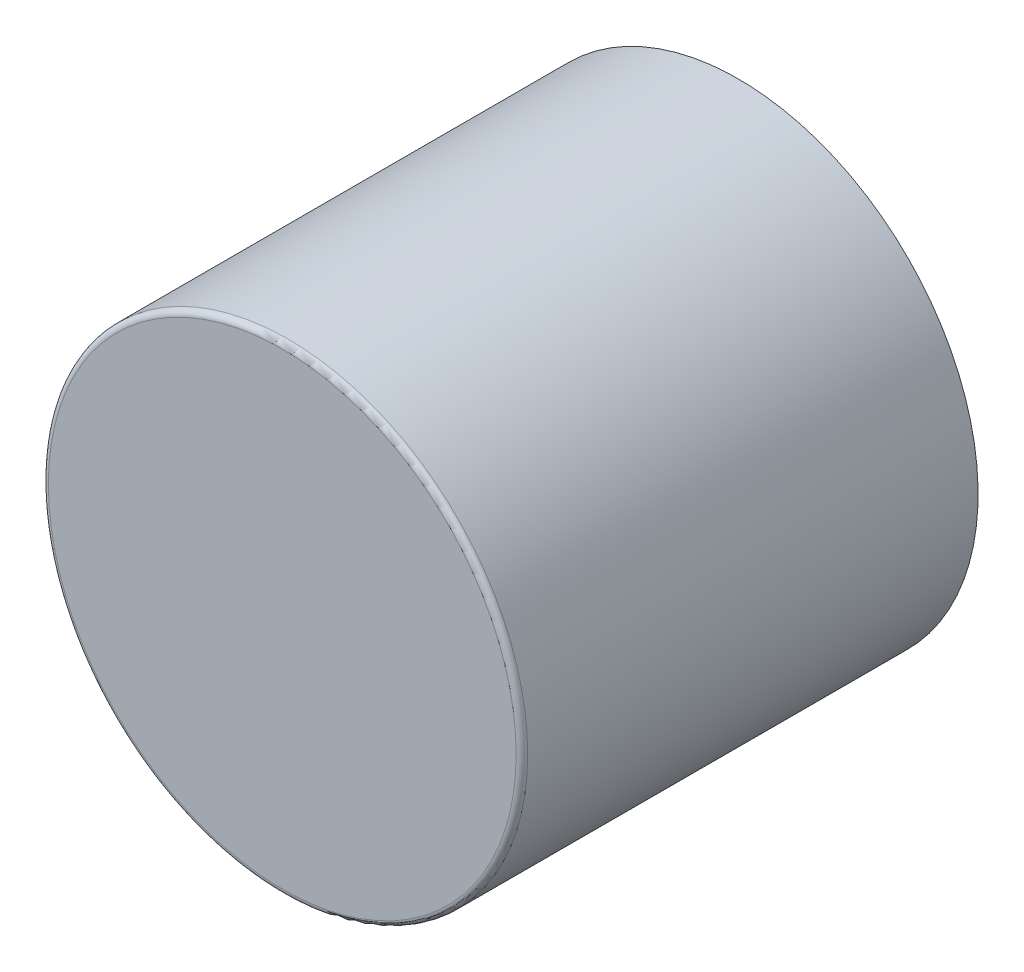
ISO-10303-21;
HEADER;
FILE_DESCRIPTION(('STEP AP214'),'2;1');
FILE_NAME('part.step','',(''),(''),'','','');
FILE_SCHEMA(('AUTOMOTIVE_DESIGN { 1 0 10303 214 1 1 1 1 }'));
ENDSEC;
DATA;
#1=APPLICATION_CONTEXT('core data for automotive mechanical design processes');
#2=APPLICATION_PROTOCOL_DEFINITION('international standard','automotive_design',2000,#1);
#3=PRODUCT_CONTEXT('',#1,'mechanical');
#4=PRODUCT('Part','Part','',(#3));
#5=PRODUCT_RELATED_PRODUCT_CATEGORY('part','',(#4));
#6=PRODUCT_DEFINITION_FORMATION('','',#4);
#7=PRODUCT_DEFINITION_CONTEXT('part definition',#1,'design');
#8=PRODUCT_DEFINITION('design','',#6,#7);
#9=PRODUCT_DEFINITION_SHAPE('','',#8);
#10=(LENGTH_UNIT() NAMED_UNIT(*) SI_UNIT(.MILLI.,.METRE.));
#11=(NAMED_UNIT(*) PLANE_ANGLE_UNIT() SI_UNIT($,.RADIAN.));
#12=(NAMED_UNIT(*) SI_UNIT($,.STERADIAN.) SOLID_ANGLE_UNIT());
#13=UNCERTAINTY_MEASURE_WITH_UNIT(LENGTH_MEASURE(1.E-05),#10,'distance_accuracy_value','');
#14=(GEOMETRIC_REPRESENTATION_CONTEXT(3) GLOBAL_UNCERTAINTY_ASSIGNED_CONTEXT((#13)) GLOBAL_UNIT_ASSIGNED_CONTEXT((#10,
#11,#12)) REPRESENTATION_CONTEXT('',''));
#15=CARTESIAN_POINT('',(0.,0.,0.));
#16=DIRECTION('',(0.,0.,1.));
#17=DIRECTION('',(1.,0.,0.));
#18=AXIS2_PLACEMENT_3D('',#15,#16,#17);
#19=CARTESIAN_POINT('',(0.,0.,-74.5));
#20=DIRECTION('',(0.,0.,-1.));
#21=DIRECTION('',(-1.,0.,0.));
#22=AXIS2_PLACEMENT_3D('',#19,#20,#21);
#23=PLANE('',#22);
#24=DIRECTION('',(0.,1.,0.));
#25=VECTOR('',#24,1.);
#26=CARTESIAN_POINT('',(2.59701534781144,1.0458509339609,-74.5));
#27=LINE('',#26,#25);
#28=CARTESIAN_POINT('',(2.59701534781145,-0.487898426832757,-74.5));
#29=VERTEX_POINT('',#28);
#30=CARTESIAN_POINT('',(2.59701534781144,1.0458509339609,-74.5));
#31=VERTEX_POINT('',#30);
#32=EDGE_CURVE('E149',#29,#31,#27,.T.);
#33=ORIENTED_EDGE('',*,*,#32,.F.);
#34=CARTESIAN_POINT('',(11.0970153478114,40.132293596347,-74.5));
#35=DIRECTION('',(0.,0.,-1.));
#36=DIRECTION('',(-1.,0.,0.));
#37=AXIS2_PLACEMENT_3D('',#34,#35,#36);
#38=CIRCLE('',#37,41.5);
#39=CARTESIAN_POINT('',(1.09694998908181,-0.144854922647389,-74.5));
#40=VERTEX_POINT('',#39);
#41=EDGE_CURVE('E174',#29,#40,#38,.T.);
#42=ORIENTED_EDGE('',*,*,#41,.T.);
#43=DIRECTION('',(0.,-1.,0.));
#44=VECTOR('',#43,1.);
#45=CARTESIAN_POINT('',(1.09694998908181,0.,-74.5));
#46=LINE('',#45,#44);
#47=CARTESIAN_POINT('',(1.09694998908181,1.40247700988313,-74.5));
#48=VERTEX_POINT('',#47);
#49=EDGE_CURVE('E81',#48,#40,#46,.T.);
#50=ORIENTED_EDGE('',*,*,#49,.F.);
#51=CARTESIAN_POINT('',(11.0970153478114,40.132293596347,-74.5));
#52=DIRECTION('',(0.,0.,-1.));
#53=DIRECTION('',(-1.,0.,0.));
#54=AXIS2_PLACEMENT_3D('',#51,#52,#53);
#55=CIRCLE('',#54,40.);
#56=EDGE_CURVE('E167',#48,#31,#55,.F.);
#57=ORIENTED_EDGE('',*,*,#56,.T.);
#58=EDGE_LOOP('',(#33,#42,#50,#57));
#59=FACE_BOUND('',#58,.T.);
#60=ADVANCED_FACE('F51',(#59),#23,.T.);
#61=CARTESIAN_POINT('',(11.0970153478114,40.132293596347,1.5));
#62=DIRECTION('',(0.,0.,-1.));
#63=DIRECTION('',(-1.,0.,0.));
#64=AXIS2_PLACEMENT_3D('',#61,#62,#63);
#65=CYLINDRICAL_SURFACE('',#64,41.5000000000001);
#66=CARTESIAN_POINT('',(11.0970153478114,40.132293596347,0.5));
#67=DIRECTION('',(0.,0.,1.));
#68=DIRECTION('',(1.,0.,0.));
#69=AXIS2_PLACEMENT_3D('',#66,#67,#68);
#70=CIRCLE('',#69,41.5000000000001);
#71=CARTESIAN_POINT('',(52.5970153478115,40.132293596347,0.5));
#72=VERTEX_POINT('',#71);
#73=EDGE_CURVE('E213',#72,#72,#70,.F.);
#74=ORIENTED_EDGE('',*,*,#73,.T.);
#75=EDGE_LOOP('',(#74));
#76=FACE_BOUND('',#75,.T.);
#77=ORIENTED_EDGE('',*,*,#41,.F.);
#78=DIRECTION('',(0.,0.,-1.));
#79=VECTOR('',#78,1.);
#80=CARTESIAN_POINT('',(2.59701534781145,-0.487898426832757,-59.5));
#81=LINE('',#80,#79);
#82=CARTESIAN_POINT('',(2.59701534781145,-0.487898426832757,-59.5));
#83=VERTEX_POINT('',#82);
#84=EDGE_CURVE('E159',#83,#29,#81,.T.);
#85=ORIENTED_EDGE('',*,*,#84,.F.);
#86=CARTESIAN_POINT('',(11.0970153478114,40.132293596347,-59.5));
#87=DIRECTION('',(0.,0.,-1.));
#88=DIRECTION('',(-1.,0.,0.));
#89=AXIS2_PLACEMENT_3D('',#86,#87,#88);
#90=CIRCLE('',#89,41.5);
#91=CARTESIAN_POINT('',(19.5970153478114,-0.487898426832756,-59.5));
#92=VERTEX_POINT('',#91);
#93=EDGE_CURVE('E138',#92,#83,#90,.T.);
#94=ORIENTED_EDGE('',*,*,#93,.F.);
#95=DIRECTION('',(0.,0.,-1.));
#96=VECTOR('',#95,1.);
#97=CARTESIAN_POINT('',(19.5970153478114,-0.487898426832756,-59.5));
#98=LINE('',#97,#96);
#99=CARTESIAN_POINT('',(19.5970153478114,-0.487898426832756,-74.5));
#100=VERTEX_POINT('',#99);
#101=EDGE_CURVE('E134',#92,#100,#98,.T.);
#102=ORIENTED_EDGE('',*,*,#101,.T.);
#103=CARTESIAN_POINT('',(21.0969499890533,-0.14488737713831,-74.5));
#104=VERTEX_POINT('',#103);
#105=EDGE_CURVE('E175',#104,#100,#38,.T.);
#106=ORIENTED_EDGE('',*,*,#105,.F.);
#107=DIRECTION('',(0.,0.,-1.));
#108=VECTOR('',#107,1.);
#109=CARTESIAN_POINT('',(21.0969499890533,-0.14488737713831,-74.5));
#110=LINE('',#109,#108);
#111=CARTESIAN_POINT('',(21.0969499890533,-0.14488737713831,-77.5));
#112=VERTEX_POINT('',#111);
#113=EDGE_CURVE('E192',#104,#112,#110,.T.);
#114=ORIENTED_EDGE('',*,*,#113,.T.);
#115=CARTESIAN_POINT('',(11.0970153478114,40.132293596347,-77.5));
#116=DIRECTION('',(0.,0.,-1.));
#117=DIRECTION('',(-1.,0.,0.));
#118=AXIS2_PLACEMENT_3D('',#115,#116,#117);
#119=CIRCLE('',#118,41.5);
#120=CARTESIAN_POINT('',(1.09694998908181,-0.144854922647389,-77.5));
#121=VERTEX_POINT('',#120);
#122=EDGE_CURVE('E205',#121,#112,#119,.T.);
#123=ORIENTED_EDGE('',*,*,#122,.F.);
#124=DIRECTION('',(0.,0.,-1.));
#125=VECTOR('',#124,1.);
#126=CARTESIAN_POINT('',(1.09694998908181,-0.144854922647389,-74.5));
#127=LINE('',#126,#125);
#128=EDGE_CURVE('E188',#40,#121,#127,.T.);
#129=ORIENTED_EDGE('',*,*,#128,.F.);
#130=EDGE_LOOP('',(#77,#85,#94,#102,#106,#114,#123,#129));
#131=FACE_BOUND('',#130,.T.);
#132=ADVANCED_FACE('F232',(#76,#131),#65,.T.);
#133=CARTESIAN_POINT('',(11.0970153478114,40.132293596347,-77.5));
#134=DIRECTION('',(0.,0.,-1.));
#135=DIRECTION('',(-1.,0.,0.));
#136=AXIS2_PLACEMENT_3D('',#133,#134,#135);
#137=PLANE('',#136);
#138=CARTESIAN_POINT('',(11.0970153478114,40.132293596347,-77.5));
#139=DIRECTION('',(0.,0.,-1.));
#140=DIRECTION('',(-1.,0.,0.));
#141=AXIS2_PLACEMENT_3D('',#138,#139,#140);
#142=CIRCLE('',#141,40.);
#143=CARTESIAN_POINT('',(1.09694998908181,1.40247700988313,-77.5));
#144=VERTEX_POINT('',#143);
#145=CARTESIAN_POINT('',(21.0969499890533,1.40244325877292,-77.5));
#146=VERTEX_POINT('',#145);
#147=EDGE_CURVE('E191',#144,#146,#142,.T.);
#148=ORIENTED_EDGE('',*,*,#147,.F.);
#149=DIRECTION('',(0.,-1.,0.));
#150=VECTOR('',#149,1.);
#151=CARTESIAN_POINT('',(1.09694998908181,0.,-77.5));
#152=LINE('',#151,#150);
#153=EDGE_CURVE('E180',#144,#121,#152,.T.);
#154=ORIENTED_EDGE('',*,*,#153,.T.);
#155=ORIENTED_EDGE('',*,*,#122,.T.);
#156=DIRECTION('',(0.,1.,0.));
#157=VECTOR('',#156,1.);
#158=CARTESIAN_POINT('',(21.0969499890533,0.,-77.5));
#159=LINE('',#158,#157);
#160=EDGE_CURVE('E166',#112,#146,#159,.T.);
#161=ORIENTED_EDGE('',*,*,#160,.T.);
#162=EDGE_LOOP('',(#148,#154,#155,#161));
#163=FACE_BOUND('',#162,.T.);
#164=ADVANCED_FACE('F240',(#163),#137,.T.);
#165=CARTESIAN_POINT('',(11.0970153478114,40.132293596347,-77.5));
#166=DIRECTION('',(0.,0.,1.));
#167=DIRECTION('',(1.,0.,0.));
#168=AXIS2_PLACEMENT_3D('',#165,#166,#167);
#169=CYLINDRICAL_SURFACE('',#168,40.);
#170=CARTESIAN_POINT('',(11.0970153478114,40.132293596347,-1.));
#171=DIRECTION('',(0.,0.,1.));
#172=DIRECTION('',(1.,0.,0.));
#173=AXIS2_PLACEMENT_3D('',#170,#171,#172);
#174=CIRCLE('',#173,40.);
#175=CARTESIAN_POINT('',(51.0970153478114,40.132293596347,-1.));
#176=VERTEX_POINT('',#175);
#177=EDGE_CURVE('E11',#176,#176,#174,.T.);
#178=ORIENTED_EDGE('',*,*,#177,.T.);
#179=EDGE_LOOP('',(#178));
#180=FACE_BOUND('',#179,.T.);
#181=DIRECTION('',(0.,0.,-1.));
#182=VECTOR('',#181,1.);
#183=CARTESIAN_POINT('',(2.59701534781144,1.0458509339609,-59.5));
#184=LINE('',#183,#182);
#185=CARTESIAN_POINT('',(2.59701534781144,1.0458509339609,-59.5));
#186=VERTEX_POINT('',#185);
#187=EDGE_CURVE('E184',#186,#31,#184,.T.);
#188=ORIENTED_EDGE('',*,*,#187,.T.);
#189=ORIENTED_EDGE('',*,*,#56,.F.);
#190=DIRECTION('',(0.,0.,-1.));
#191=VECTOR('',#190,1.);
#192=CARTESIAN_POINT('',(1.09694998908181,1.40247700988313,-74.5));
#193=LINE('',#192,#191);
#194=EDGE_CURVE('E179',#48,#144,#193,.T.);
#195=ORIENTED_EDGE('',*,*,#194,.T.);
#196=ORIENTED_EDGE('',*,*,#147,.T.);
#197=DIRECTION('',(0.,0.,-1.));
#198=VECTOR('',#197,1.);
#199=CARTESIAN_POINT('',(21.0969499890533,1.40244325877292,-74.5));
#200=LINE('',#199,#198);
#201=CARTESIAN_POINT('',(21.0969499890533,1.40244325877292,-74.5));
#202=VERTEX_POINT('',#201);
#203=EDGE_CURVE('E196',#202,#146,#200,.T.);
#204=ORIENTED_EDGE('',*,*,#203,.F.);
#205=CARTESIAN_POINT('',(19.5970153478114,1.0458509339609,-74.5));
#206=VERTEX_POINT('',#205);
#207=EDGE_CURVE('E154',#206,#202,#55,.F.);
#208=ORIENTED_EDGE('',*,*,#207,.F.);
#209=DIRECTION('',(0.,0.,-1.));
#210=VECTOR('',#209,1.);
#211=CARTESIAN_POINT('',(19.5970153478114,1.0458509339609,-59.5));
#212=LINE('',#211,#210);
#213=CARTESIAN_POINT('',(19.5970153478114,1.0458509339609,-59.5));
#214=VERTEX_POINT('',#213);
#215=EDGE_CURVE('E70',#214,#206,#212,.T.);
#216=ORIENTED_EDGE('',*,*,#215,.F.);
#217=CARTESIAN_POINT('',(11.0970153478114,40.132293596347,-59.5));
#218=DIRECTION('',(0.,0.,1.));
#219=DIRECTION('',(-1.,0.,0.));
#220=AXIS2_PLACEMENT_3D('',#217,#218,#219);
#221=CIRCLE('',#220,40.);
#222=EDGE_CURVE('E139',#186,#214,#221,.T.);
#223=ORIENTED_EDGE('',*,*,#222,.F.);
#224=EDGE_LOOP('',(#188,#189,#195,#196,#204,#208,#216,#223));
#225=FACE_BOUND('',#224,.T.);
#226=ADVANCED_FACE('F152',(#180,#225),#169,.F.);
#227=CARTESIAN_POINT('',(0.,0.,1.5));
#228=DIRECTION('',(0.,0.,1.));
#229=DIRECTION('',(1.,0.,0.));
#230=AXIS2_PLACEMENT_3D('',#227,#228,#229);
#231=PLANE('',#230);
#232=CARTESIAN_POINT('',(11.0970153478114,40.132293596347,1.5));
#233=DIRECTION('',(0.,0.,1.));
#234=DIRECTION('',(1.,0.,0.));
#235=AXIS2_PLACEMENT_3D('',#232,#233,#234);
#236=CIRCLE('',#235,40.5000000000001);
#237=CARTESIAN_POINT('',(51.5970153478115,40.132293596347,1.5));
#238=VERTEX_POINT('',#237);
#239=EDGE_CURVE('E209',#238,#238,#236,.T.);
#240=ORIENTED_EDGE('',*,*,#239,.T.);
#241=EDGE_LOOP('',(#240));
#242=FACE_BOUND('',#241,.T.);
#243=ADVANCED_FACE('F283',(#242),#231,.T.);
#244=CARTESIAN_POINT('',(0.,0.,0.));
#245=DIRECTION('',(0.,0.,1.));
#246=DIRECTION('',(1.,0.,0.));
#247=AXIS2_PLACEMENT_3D('',#244,#245,#246);
#248=PLANE('',#247);
#249=CARTESIAN_POINT('',(11.0970153478114,40.132293596347,0.));
#250=DIRECTION('',(0.,0.,1.));
#251=DIRECTION('',(1.,0.,0.));
#252=AXIS2_PLACEMENT_3D('',#249,#250,#251);
#253=CIRCLE('',#252,39.);
#254=CARTESIAN_POINT('',(50.0970153478114,40.132293596347,0.));
#255=VERTEX_POINT('',#254);
#256=EDGE_CURVE('E60',#255,#255,#253,.F.);
#257=ORIENTED_EDGE('',*,*,#256,.T.);
#258=EDGE_LOOP('',(#257));
#259=FACE_BOUND('',#258,.T.);
#260=ADVANCED_FACE('F220',(#259),#248,.F.);
#261=CARTESIAN_POINT('',(1.09694998908181,0.,-74.5));
#262=DIRECTION('',(1.,0.,0.));
#263=DIRECTION('',(0.,0.,-1.));
#264=AXIS2_PLACEMENT_3D('',#261,#262,#263);
#265=PLANE('',#264);
#266=ORIENTED_EDGE('',*,*,#153,.F.);
#267=ORIENTED_EDGE('',*,*,#194,.F.);
#268=ORIENTED_EDGE('',*,*,#49,.T.);
#269=ORIENTED_EDGE('',*,*,#128,.T.);
#270=EDGE_LOOP('',(#266,#267,#268,#269));
#271=FACE_BOUND('',#270,.T.);
#272=ADVANCED_FACE('F254',(#271),#265,.T.);
#273=CARTESIAN_POINT('',(21.0969499890533,0.,-74.5));
#274=DIRECTION('',(-1.,0.,0.));
#275=DIRECTION('',(0.,0.,1.));
#276=AXIS2_PLACEMENT_3D('',#273,#274,#275);
#277=PLANE('',#276);
#278=ORIENTED_EDGE('',*,*,#160,.F.);
#279=ORIENTED_EDGE('',*,*,#113,.F.);
#280=DIRECTION('',(0.,1.,0.));
#281=VECTOR('',#280,1.);
#282=CARTESIAN_POINT('',(21.0969499890533,0.,-74.5));
#283=LINE('',#282,#281);
#284=EDGE_CURVE('E170',#104,#202,#283,.T.);
#285=ORIENTED_EDGE('',*,*,#284,.T.);
#286=ORIENTED_EDGE('',*,*,#203,.T.);
#287=EDGE_LOOP('',(#278,#279,#285,#286));
#288=FACE_BOUND('',#287,.T.);
#289=ADVANCED_FACE('F248',(#288),#277,.T.);
#290=DIRECTION('',(0.,-1.,0.));
#291=VECTOR('',#290,1.);
#292=CARTESIAN_POINT('',(19.5970153478114,1.0458509339609,-74.5));
#293=LINE('',#292,#291);
#294=EDGE_CURVE('E256',#206,#100,#293,.T.);
#295=ORIENTED_EDGE('',*,*,#294,.F.);
#296=ORIENTED_EDGE('',*,*,#207,.T.);
#297=ORIENTED_EDGE('',*,*,#284,.F.);
#298=ORIENTED_EDGE('',*,*,#105,.T.);
#299=EDGE_LOOP('',(#295,#296,#297,#298));
#300=FACE_BOUND('',#299,.T.);
#301=ADVANCED_FACE('F234',(#300),#23,.T.);
#302=CARTESIAN_POINT('',(2.59701534781144,1.0458509339609,-59.5));
#303=DIRECTION('',(-1.,0.,0.));
#304=DIRECTION('',(0.,0.,1.));
#305=AXIS2_PLACEMENT_3D('',#302,#303,#304);
#306=PLANE('',#305);
#307=ORIENTED_EDGE('',*,*,#32,.T.);
#308=ORIENTED_EDGE('',*,*,#187,.F.);
#309=DIRECTION('',(0.,1.,0.));
#310=VECTOR('',#309,1.);
#311=CARTESIAN_POINT('',(2.59701534781144,1.0458509339609,-59.5));
#312=LINE('',#311,#310);
#313=EDGE_CURVE('E145',#83,#186,#312,.T.);
#314=ORIENTED_EDGE('',*,*,#313,.F.);
#315=ORIENTED_EDGE('',*,*,#84,.T.);
#316=EDGE_LOOP('',(#307,#308,#314,#315));
#317=FACE_BOUND('',#316,.T.);
#318=ADVANCED_FACE('F247',(#317),#306,.F.);
#319=CARTESIAN_POINT('',(19.5970153478114,1.0458509339609,-59.5));
#320=DIRECTION('',(1.,0.,0.));
#321=DIRECTION('',(0.,0.,-1.));
#322=AXIS2_PLACEMENT_3D('',#319,#320,#321);
#323=PLANE('',#322);
#324=ORIENTED_EDGE('',*,*,#294,.T.);
#325=ORIENTED_EDGE('',*,*,#101,.F.);
#326=DIRECTION('',(0.,-1.,0.));
#327=VECTOR('',#326,1.);
#328=CARTESIAN_POINT('',(19.5970153478114,1.0458509339609,-59.5));
#329=LINE('',#328,#327);
#330=EDGE_CURVE('E130',#214,#92,#329,.T.);
#331=ORIENTED_EDGE('',*,*,#330,.F.);
#332=ORIENTED_EDGE('',*,*,#215,.T.);
#333=EDGE_LOOP('',(#324,#325,#331,#332));
#334=FACE_BOUND('',#333,.T.);
#335=ADVANCED_FACE('F132',(#334),#323,.F.);
#336=CARTESIAN_POINT('',(11.0970153478114,40.132293596347,-59.5));
#337=DIRECTION('',(0.,0.,-1.));
#338=DIRECTION('',(-1.,0.,0.));
#339=AXIS2_PLACEMENT_3D('',#336,#337,#338);
#340=PLANE('',#339);
#341=ORIENTED_EDGE('',*,*,#222,.T.);
#342=ORIENTED_EDGE('',*,*,#330,.T.);
#343=ORIENTED_EDGE('',*,*,#93,.T.);
#344=ORIENTED_EDGE('',*,*,#313,.T.);
#345=EDGE_LOOP('',(#341,#342,#343,#344));
#346=FACE_BOUND('',#345,.T.);
#347=ADVANCED_FACE('F143',(#346),#340,.T.);
#348=CARTESIAN_POINT('',(11.0970153478114,40.132293596347,0.5));
#349=DIRECTION('',(0.,0.,1.));
#350=DIRECTION('',(1.,0.,0.));
#351=AXIS2_PLACEMENT_3D('',#348,#349,#350);
#352=TOROIDAL_SURFACE('',#351,40.5000000000001,1.);
#353=ORIENTED_EDGE('',*,*,#73,.F.);
#354=EDGE_LOOP('',(#353));
#355=FACE_BOUND('',#354,.T.);
#356=ORIENTED_EDGE('',*,*,#239,.F.);
#357=EDGE_LOOP('',(#356));
#358=FACE_BOUND('',#357,.T.);
#359=ADVANCED_FACE('F223',(#355,#358),#352,.T.);
#360=CARTESIAN_POINT('',(11.0970153478114,40.132293596347,-1.));
#361=DIRECTION('',(0.,0.,1.));
#362=DIRECTION('',(1.,0.,0.));
#363=AXIS2_PLACEMENT_3D('',#360,#361,#362);
#364=TOROIDAL_SURFACE('',#363,39.,1.);
#365=ORIENTED_EDGE('',*,*,#177,.F.);
#366=EDGE_LOOP('',(#365));
#367=FACE_BOUND('',#366,.T.);
#368=ORIENTED_EDGE('',*,*,#256,.F.);
#369=EDGE_LOOP('',(#368));
#370=FACE_BOUND('',#369,.T.);
#371=ADVANCED_FACE('F53',(#367,#370),#364,.F.);
#372=CLOSED_SHELL('',(#60,#132,#164,#226,#243,#260,#272,#289,#301,#318,#335,#347,#359,#371));
#373=MANIFOLD_SOLID_BREP('B2',#372);
#374=ADVANCED_BREP_SHAPE_REPRESENTATION('',(#18,#373),#14);
#375=SHAPE_DEFINITION_REPRESENTATION(#9,#374);
ENDSEC;
END-ISO-10303-21;
